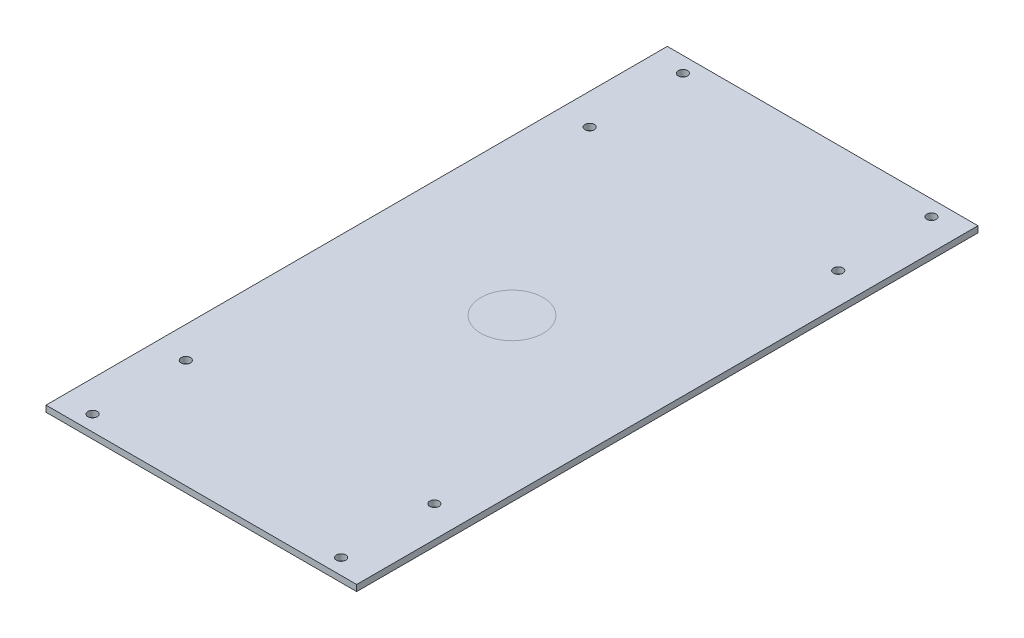
ISO-10303-21;
HEADER;
FILE_DESCRIPTION(('STEP AP214'),'2;1');
FILE_NAME('part.step','',(''),(''),'','','');
FILE_SCHEMA(('AUTOMOTIVE_DESIGN { 1 0 10303 214 1 1 1 1 }'));
ENDSEC;
DATA;
#1=APPLICATION_CONTEXT('core data for automotive mechanical design processes');
#2=APPLICATION_PROTOCOL_DEFINITION('international standard','automotive_design',2000,#1);
#3=PRODUCT_CONTEXT('',#1,'mechanical');
#4=PRODUCT('Part','Part','',(#3));
#5=PRODUCT_RELATED_PRODUCT_CATEGORY('part','',(#4));
#6=PRODUCT_DEFINITION_FORMATION('','',#4);
#7=PRODUCT_DEFINITION_CONTEXT('part definition',#1,'design');
#8=PRODUCT_DEFINITION('design','',#6,#7);
#9=PRODUCT_DEFINITION_SHAPE('','',#8);
#10=(LENGTH_UNIT() NAMED_UNIT(*) SI_UNIT(.MILLI.,.METRE.));
#11=(NAMED_UNIT(*) PLANE_ANGLE_UNIT() SI_UNIT($,.RADIAN.));
#12=(NAMED_UNIT(*) SI_UNIT($,.STERADIAN.) SOLID_ANGLE_UNIT());
#13=UNCERTAINTY_MEASURE_WITH_UNIT(LENGTH_MEASURE(1.E-05),#10,'distance_accuracy_value','');
#14=(GEOMETRIC_REPRESENTATION_CONTEXT(3) GLOBAL_UNCERTAINTY_ASSIGNED_CONTEXT((#13)) GLOBAL_UNIT_ASSIGNED_CONTEXT((#10,
#11,#12)) REPRESENTATION_CONTEXT('',''));
#15=CARTESIAN_POINT('',(0.,0.,0.));
#16=DIRECTION('',(0.,0.,1.));
#17=DIRECTION('',(1.,0.,0.));
#18=AXIS2_PLACEMENT_3D('',#15,#16,#17);
#19=CARTESIAN_POINT('',(0.,2.,0.));
#20=DIRECTION('',(0.,-1.,0.));
#21=DIRECTION('',(0.,0.,-1.));
#22=AXIS2_PLACEMENT_3D('',#19,#20,#21);
#23=PLANE('',#22);
#24=CARTESIAN_POINT('',(-40.,2.,-95.));
#25=DIRECTION('',(0.,1.,0.));
#26=DIRECTION('',(0.,0.,1.));
#27=AXIS2_PLACEMENT_3D('',#24,#25,#26);
#28=CIRCLE('',#27,1.49999999999999);
#29=CARTESIAN_POINT('',(-40.,2.,-93.5));
#30=VERTEX_POINT('',#29);
#31=EDGE_CURVE('E177',#30,#30,#28,.T.);
#32=ORIENTED_EDGE('',*,*,#31,.F.);
#33=EDGE_LOOP('',(#32));
#34=FACE_BOUND('',#33,.T.);
#35=CARTESIAN_POINT('',(40.,2.,-95.));
#36=DIRECTION('',(0.,1.,0.));
#37=DIRECTION('',(0.,0.,1.));
#38=AXIS2_PLACEMENT_3D('',#35,#36,#37);
#39=CIRCLE('',#38,1.49999999999999);
#40=CARTESIAN_POINT('',(40.,2.,-93.5));
#41=VERTEX_POINT('',#40);
#42=EDGE_CURVE('E179',#41,#41,#39,.T.);
#43=ORIENTED_EDGE('',*,*,#42,.F.);
#44=EDGE_LOOP('',(#43));
#45=FACE_BOUND('',#44,.T.);
#46=CARTESIAN_POINT('',(-40.,2.,-65.));
#47=DIRECTION('',(0.,1.,0.));
#48=DIRECTION('',(0.,0.,1.));
#49=AXIS2_PLACEMENT_3D('',#46,#47,#48);
#50=CIRCLE('',#49,1.49999999999999);
#51=CARTESIAN_POINT('',(-40.,2.,-63.5));
#52=VERTEX_POINT('',#51);
#53=EDGE_CURVE('E187',#52,#52,#50,.T.);
#54=ORIENTED_EDGE('',*,*,#53,.F.);
#55=EDGE_LOOP('',(#54));
#56=FACE_BOUND('',#55,.T.);
#57=CARTESIAN_POINT('',(40.,2.,-65.));
#58=DIRECTION('',(0.,1.,0.));
#59=DIRECTION('',(0.,0.,1.));
#60=AXIS2_PLACEMENT_3D('',#57,#58,#59);
#61=CIRCLE('',#60,1.49999999999999);
#62=CARTESIAN_POINT('',(40.,2.,-63.5));
#63=VERTEX_POINT('',#62);
#64=EDGE_CURVE('E193',#63,#63,#61,.T.);
#65=ORIENTED_EDGE('',*,*,#64,.F.);
#66=EDGE_LOOP('',(#65));
#67=FACE_BOUND('',#66,.T.);
#68=CARTESIAN_POINT('',(-40.,2.,65.));
#69=DIRECTION('',(0.,1.,0.));
#70=DIRECTION('',(0.,0.,1.));
#71=AXIS2_PLACEMENT_3D('',#68,#69,#70);
#72=CIRCLE('',#71,1.49999999999999);
#73=CARTESIAN_POINT('',(-40.,2.,66.5));
#74=VERTEX_POINT('',#73);
#75=EDGE_CURVE('E199',#74,#74,#72,.T.);
#76=ORIENTED_EDGE('',*,*,#75,.F.);
#77=EDGE_LOOP('',(#76));
#78=FACE_BOUND('',#77,.T.);
#79=CARTESIAN_POINT('',(-40.,2.,95.));
#80=DIRECTION('',(0.,1.,0.));
#81=DIRECTION('',(0.,0.,1.));
#82=AXIS2_PLACEMENT_3D('',#79,#80,#81);
#83=CIRCLE('',#82,1.49999999999999);
#84=CARTESIAN_POINT('',(-40.,2.,96.5));
#85=VERTEX_POINT('',#84);
#86=EDGE_CURVE('E205',#85,#85,#83,.T.);
#87=ORIENTED_EDGE('',*,*,#86,.F.);
#88=EDGE_LOOP('',(#87));
#89=FACE_BOUND('',#88,.T.);
#90=CARTESIAN_POINT('',(40.,2.,65.));
#91=DIRECTION('',(0.,1.,0.));
#92=DIRECTION('',(0.,0.,1.));
#93=AXIS2_PLACEMENT_3D('',#90,#91,#92);
#94=CIRCLE('',#93,1.49999999999999);
#95=CARTESIAN_POINT('',(40.,2.,66.5));
#96=VERTEX_POINT('',#95);
#97=EDGE_CURVE('E211',#96,#96,#94,.T.);
#98=ORIENTED_EDGE('',*,*,#97,.F.);
#99=EDGE_LOOP('',(#98));
#100=FACE_BOUND('',#99,.T.);
#101=CARTESIAN_POINT('',(40.,2.,95.));
#102=DIRECTION('',(0.,1.,0.));
#103=DIRECTION('',(0.,0.,1.));
#104=AXIS2_PLACEMENT_3D('',#101,#102,#103);
#105=CIRCLE('',#104,1.49999999999999);
#106=CARTESIAN_POINT('',(40.,2.,96.5));
#107=VERTEX_POINT('',#106);
#108=EDGE_CURVE('E217',#107,#107,#105,.T.);
#109=ORIENTED_EDGE('',*,*,#108,.F.);
#110=EDGE_LOOP('',(#109));
#111=FACE_BOUND('',#110,.T.);
#112=DIRECTION('',(1.,0.,0.));
#113=VECTOR('',#112,1.);
#114=CARTESIAN_POINT('',(-50.,2.,-100.));
#115=LINE('',#114,#113);
#116=CARTESIAN_POINT('',(-50.,2.,-100.));
#117=VERTEX_POINT('',#116);
#118=CARTESIAN_POINT('',(50.,2.,-100.));
#119=VERTEX_POINT('',#118);
#120=EDGE_CURVE('E102',#117,#119,#115,.T.);
#121=ORIENTED_EDGE('',*,*,#120,.F.);
#122=DIRECTION('',(0.,0.,1.));
#123=VECTOR('',#122,1.);
#124=CARTESIAN_POINT('',(-50.,2.,-100.));
#125=LINE('',#124,#123);
#126=CARTESIAN_POINT('',(-50.,2.,100.));
#127=VERTEX_POINT('',#126);
#128=EDGE_CURVE('E90',#117,#127,#125,.T.);
#129=ORIENTED_EDGE('',*,*,#128,.T.);
#130=DIRECTION('',(1.,0.,0.));
#131=VECTOR('',#130,1.);
#132=CARTESIAN_POINT('',(-50.,2.,100.));
#133=LINE('',#132,#131);
#134=CARTESIAN_POINT('',(50.,2.,100.));
#135=VERTEX_POINT('',#134);
#136=EDGE_CURVE('E85',#127,#135,#133,.T.);
#137=ORIENTED_EDGE('',*,*,#136,.T.);
#138=DIRECTION('',(0.,0.,1.));
#139=VECTOR('',#138,1.);
#140=CARTESIAN_POINT('',(50.,2.,-100.));
#141=LINE('',#140,#139);
#142=EDGE_CURVE('E89',#119,#135,#141,.T.);
#143=ORIENTED_EDGE('',*,*,#142,.F.);
#144=EDGE_LOOP('',(#121,#129,#137,#143));
#145=FACE_BOUND('',#144,.T.);
#146=CARTESIAN_POINT('',(0.,2.,0.));
#147=DIRECTION('',(0.,-1.,0.));
#148=DIRECTION('',(0.,0.,-1.));
#149=AXIS2_PLACEMENT_3D('',#146,#147,#148);
#150=CIRCLE('',#149,10.);
#151=CARTESIAN_POINT('',(0.,2.,-10.));
#152=VERTEX_POINT('',#151);
#153=EDGE_CURVE('E11',#152,#152,#150,.F.);
#154=ORIENTED_EDGE('',*,*,#153,.F.);
#155=EDGE_LOOP('',(#154));
#156=FACE_BOUND('',#155,.T.);
#157=ADVANCED_FACE('F38',(#34,#45,#56,#67,#78,#89,#100,#111,#145,#156),#23,.F.);
#158=CARTESIAN_POINT('',(-50.,2.,-100.));
#159=DIRECTION('',(0.,0.,-1.));
#160=DIRECTION('',(-1.,0.,0.));
#161=AXIS2_PLACEMENT_3D('',#158,#159,#160);
#162=PLANE('',#161);
#163=DIRECTION('',(1.,0.,0.));
#164=VECTOR('',#163,1.);
#165=CARTESIAN_POINT('',(-50.,0.,-100.));
#166=LINE('',#165,#164);
#167=CARTESIAN_POINT('',(-50.,0.,-100.));
#168=VERTEX_POINT('',#167);
#169=CARTESIAN_POINT('',(50.,0.,-100.));
#170=VERTEX_POINT('',#169);
#171=EDGE_CURVE('E108',#168,#170,#166,.T.);
#172=ORIENTED_EDGE('',*,*,#171,.F.);
#173=DIRECTION('',(0.,-1.,0.));
#174=VECTOR('',#173,1.);
#175=CARTESIAN_POINT('',(-50.,2.,-100.));
#176=LINE('',#175,#174);
#177=EDGE_CURVE('E48',#117,#168,#176,.T.);
#178=ORIENTED_EDGE('',*,*,#177,.F.);
#179=ORIENTED_EDGE('',*,*,#120,.T.);
#180=DIRECTION('',(0.,-1.,0.));
#181=VECTOR('',#180,1.);
#182=CARTESIAN_POINT('',(50.,2.,-100.));
#183=LINE('',#182,#181);
#184=EDGE_CURVE('E80',#119,#170,#183,.T.);
#185=ORIENTED_EDGE('',*,*,#184,.T.);
#186=EDGE_LOOP('',(#172,#178,#179,#185));
#187=FACE_BOUND('',#186,.T.);
#188=ADVANCED_FACE('F40',(#187),#162,.T.);
#189=CARTESIAN_POINT('',(-50.,2.,-100.));
#190=DIRECTION('',(1.,0.,0.));
#191=DIRECTION('',(0.,0.,-1.));
#192=AXIS2_PLACEMENT_3D('',#189,#190,#191);
#193=PLANE('',#192);
#194=DIRECTION('',(0.,0.,1.));
#195=VECTOR('',#194,1.);
#196=CARTESIAN_POINT('',(-50.,0.,-100.));
#197=LINE('',#196,#195);
#198=CARTESIAN_POINT('',(-50.,0.,100.));
#199=VERTEX_POINT('',#198);
#200=EDGE_CURVE('E72',#168,#199,#197,.T.);
#201=ORIENTED_EDGE('',*,*,#200,.T.);
#202=DIRECTION('',(0.,-1.,0.));
#203=VECTOR('',#202,1.);
#204=CARTESIAN_POINT('',(-50.,2.,100.));
#205=LINE('',#204,#203);
#206=EDGE_CURVE('E99',#127,#199,#205,.T.);
#207=ORIENTED_EDGE('',*,*,#206,.F.);
#208=ORIENTED_EDGE('',*,*,#128,.F.);
#209=ORIENTED_EDGE('',*,*,#177,.T.);
#210=EDGE_LOOP('',(#201,#207,#208,#209));
#211=FACE_BOUND('',#210,.T.);
#212=ADVANCED_FACE('F141',(#211),#193,.F.);
#213=CARTESIAN_POINT('',(-50.,2.,100.));
#214=DIRECTION('',(0.,0.,-1.));
#215=DIRECTION('',(-1.,0.,0.));
#216=AXIS2_PLACEMENT_3D('',#213,#214,#215);
#217=PLANE('',#216);
#218=DIRECTION('',(1.,0.,0.));
#219=VECTOR('',#218,1.);
#220=CARTESIAN_POINT('',(-50.,0.,100.));
#221=LINE('',#220,#219);
#222=CARTESIAN_POINT('',(50.,0.,100.));
#223=VERTEX_POINT('',#222);
#224=EDGE_CURVE('E97',#199,#223,#221,.T.);
#225=ORIENTED_EDGE('',*,*,#224,.T.);
#226=DIRECTION('',(0.,-1.,0.));
#227=VECTOR('',#226,1.);
#228=CARTESIAN_POINT('',(50.,2.,100.));
#229=LINE('',#228,#227);
#230=EDGE_CURVE('E94',#135,#223,#229,.T.);
#231=ORIENTED_EDGE('',*,*,#230,.F.);
#232=ORIENTED_EDGE('',*,*,#136,.F.);
#233=ORIENTED_EDGE('',*,*,#206,.T.);
#234=EDGE_LOOP('',(#225,#231,#232,#233));
#235=FACE_BOUND('',#234,.T.);
#236=ADVANCED_FACE('F95',(#235),#217,.F.);
#237=CARTESIAN_POINT('',(50.,2.,-100.));
#238=DIRECTION('',(1.,0.,0.));
#239=DIRECTION('',(0.,0.,-1.));
#240=AXIS2_PLACEMENT_3D('',#237,#238,#239);
#241=PLANE('',#240);
#242=DIRECTION('',(0.,0.,1.));
#243=VECTOR('',#242,1.);
#244=CARTESIAN_POINT('',(50.,0.,-100.));
#245=LINE('',#244,#243);
#246=EDGE_CURVE('E111',#170,#223,#245,.T.);
#247=ORIENTED_EDGE('',*,*,#246,.F.);
#248=ORIENTED_EDGE('',*,*,#184,.F.);
#249=ORIENTED_EDGE('',*,*,#142,.T.);
#250=ORIENTED_EDGE('',*,*,#230,.T.);
#251=EDGE_LOOP('',(#247,#248,#249,#250));
#252=FACE_BOUND('',#251,.T.);
#253=ADVANCED_FACE('F101',(#252),#241,.T.);
#254=ORIENTED_EDGE('',*,*,#153,.T.);
#255=EDGE_LOOP('',(#254));
#256=FACE_BOUND('',#255,.T.);
#257=ADVANCED_FACE('F121',(#256),#23,.F.);
#258=CARTESIAN_POINT('',(0.,0.,0.));
#259=DIRECTION('',(0.,-1.,0.));
#260=DIRECTION('',(0.,0.,-1.));
#261=AXIS2_PLACEMENT_3D('',#258,#259,#260);
#262=PLANE('',#261);
#263=CARTESIAN_POINT('',(-40.,0.,-95.));
#264=DIRECTION('',(0.,1.,0.));
#265=DIRECTION('',(0.,0.,1.));
#266=AXIS2_PLACEMENT_3D('',#263,#264,#265);
#267=CIRCLE('',#266,1.5);
#268=CARTESIAN_POINT('',(-40.,0.,-93.5));
#269=VERTEX_POINT('',#268);
#270=EDGE_CURVE('E175',#269,#269,#267,.T.);
#271=ORIENTED_EDGE('',*,*,#270,.T.);
#272=EDGE_LOOP('',(#271));
#273=FACE_BOUND('',#272,.T.);
#274=CARTESIAN_POINT('',(40.,0.,-95.));
#275=DIRECTION('',(0.,1.,0.));
#276=DIRECTION('',(0.,0.,1.));
#277=AXIS2_PLACEMENT_3D('',#274,#275,#276);
#278=CIRCLE('',#277,1.5);
#279=CARTESIAN_POINT('',(40.,0.,-93.5));
#280=VERTEX_POINT('',#279);
#281=EDGE_CURVE('E184',#280,#280,#278,.T.);
#282=ORIENTED_EDGE('',*,*,#281,.T.);
#283=EDGE_LOOP('',(#282));
#284=FACE_BOUND('',#283,.T.);
#285=CARTESIAN_POINT('',(-40.,0.,-65.));
#286=DIRECTION('',(0.,1.,0.));
#287=DIRECTION('',(0.,0.,1.));
#288=AXIS2_PLACEMENT_3D('',#285,#286,#287);
#289=CIRCLE('',#288,1.5);
#290=CARTESIAN_POINT('',(-40.,0.,-63.5));
#291=VERTEX_POINT('',#290);
#292=EDGE_CURVE('E190',#291,#291,#289,.T.);
#293=ORIENTED_EDGE('',*,*,#292,.T.);
#294=EDGE_LOOP('',(#293));
#295=FACE_BOUND('',#294,.T.);
#296=CARTESIAN_POINT('',(40.,0.,-65.));
#297=DIRECTION('',(0.,1.,0.));
#298=DIRECTION('',(0.,0.,1.));
#299=AXIS2_PLACEMENT_3D('',#296,#297,#298);
#300=CIRCLE('',#299,1.5);
#301=CARTESIAN_POINT('',(40.,0.,-63.5));
#302=VERTEX_POINT('',#301);
#303=EDGE_CURVE('E196',#302,#302,#300,.T.);
#304=ORIENTED_EDGE('',*,*,#303,.T.);
#305=EDGE_LOOP('',(#304));
#306=FACE_BOUND('',#305,.T.);
#307=CARTESIAN_POINT('',(-40.,0.,65.));
#308=DIRECTION('',(0.,1.,0.));
#309=DIRECTION('',(0.,0.,1.));
#310=AXIS2_PLACEMENT_3D('',#307,#308,#309);
#311=CIRCLE('',#310,1.5);
#312=CARTESIAN_POINT('',(-40.,0.,66.5));
#313=VERTEX_POINT('',#312);
#314=EDGE_CURVE('E202',#313,#313,#311,.T.);
#315=ORIENTED_EDGE('',*,*,#314,.T.);
#316=EDGE_LOOP('',(#315));
#317=FACE_BOUND('',#316,.T.);
#318=CARTESIAN_POINT('',(-40.,0.,95.));
#319=DIRECTION('',(0.,1.,0.));
#320=DIRECTION('',(0.,0.,1.));
#321=AXIS2_PLACEMENT_3D('',#318,#319,#320);
#322=CIRCLE('',#321,1.5);
#323=CARTESIAN_POINT('',(-40.,0.,96.5));
#324=VERTEX_POINT('',#323);
#325=EDGE_CURVE('E208',#324,#324,#322,.T.);
#326=ORIENTED_EDGE('',*,*,#325,.T.);
#327=EDGE_LOOP('',(#326));
#328=FACE_BOUND('',#327,.T.);
#329=CARTESIAN_POINT('',(40.,0.,65.));
#330=DIRECTION('',(0.,1.,0.));
#331=DIRECTION('',(0.,0.,1.));
#332=AXIS2_PLACEMENT_3D('',#329,#330,#331);
#333=CIRCLE('',#332,1.5);
#334=CARTESIAN_POINT('',(40.,0.,66.5));
#335=VERTEX_POINT('',#334);
#336=EDGE_CURVE('E214',#335,#335,#333,.T.);
#337=ORIENTED_EDGE('',*,*,#336,.T.);
#338=EDGE_LOOP('',(#337));
#339=FACE_BOUND('',#338,.T.);
#340=CARTESIAN_POINT('',(40.,0.,95.));
#341=DIRECTION('',(0.,1.,0.));
#342=DIRECTION('',(0.,0.,1.));
#343=AXIS2_PLACEMENT_3D('',#340,#341,#342);
#344=CIRCLE('',#343,1.5);
#345=CARTESIAN_POINT('',(40.,0.,96.5));
#346=VERTEX_POINT('',#345);
#347=EDGE_CURVE('E112',#346,#346,#344,.T.);
#348=ORIENTED_EDGE('',*,*,#347,.T.);
#349=EDGE_LOOP('',(#348));
#350=FACE_BOUND('',#349,.T.);
#351=ORIENTED_EDGE('',*,*,#171,.T.);
#352=ORIENTED_EDGE('',*,*,#246,.T.);
#353=ORIENTED_EDGE('',*,*,#224,.F.);
#354=ORIENTED_EDGE('',*,*,#200,.F.);
#355=EDGE_LOOP('',(#351,#352,#353,#354));
#356=FACE_BOUND('',#355,.T.);
#357=ADVANCED_FACE('F118',(#273,#284,#295,#306,#317,#328,#339,#350,#356),#262,.T.);
#358=CARTESIAN_POINT('',(40.,2.,95.));
#359=DIRECTION('',(0.,1.,0.));
#360=DIRECTION('',(0.,0.,1.));
#361=AXIS2_PLACEMENT_3D('',#358,#359,#360);
#362=CYLINDRICAL_SURFACE('',#361,1.49999999999999);
#363=ORIENTED_EDGE('',*,*,#347,.F.);
#364=EDGE_LOOP('',(#363));
#365=FACE_BOUND('',#364,.T.);
#366=ORIENTED_EDGE('',*,*,#108,.T.);
#367=EDGE_LOOP('',(#366));
#368=FACE_BOUND('',#367,.T.);
#369=ADVANCED_FACE('F120',(#365,#368),#362,.F.);
#370=CARTESIAN_POINT('',(40.,2.,65.));
#371=DIRECTION('',(0.,1.,0.));
#372=DIRECTION('',(0.,0.,1.));
#373=AXIS2_PLACEMENT_3D('',#370,#371,#372);
#374=CYLINDRICAL_SURFACE('',#373,1.49999999999999);
#375=ORIENTED_EDGE('',*,*,#336,.F.);
#376=EDGE_LOOP('',(#375));
#377=FACE_BOUND('',#376,.T.);
#378=ORIENTED_EDGE('',*,*,#97,.T.);
#379=EDGE_LOOP('',(#378));
#380=FACE_BOUND('',#379,.T.);
#381=ADVANCED_FACE('F128',(#377,#380),#374,.F.);
#382=CARTESIAN_POINT('',(-40.,2.,95.));
#383=DIRECTION('',(0.,1.,0.));
#384=DIRECTION('',(0.,0.,1.));
#385=AXIS2_PLACEMENT_3D('',#382,#383,#384);
#386=CYLINDRICAL_SURFACE('',#385,1.49999999999999);
#387=ORIENTED_EDGE('',*,*,#325,.F.);
#388=EDGE_LOOP('',(#387));
#389=FACE_BOUND('',#388,.T.);
#390=ORIENTED_EDGE('',*,*,#86,.T.);
#391=EDGE_LOOP('',(#390));
#392=FACE_BOUND('',#391,.T.);
#393=ADVANCED_FACE('F147',(#389,#392),#386,.F.);
#394=CARTESIAN_POINT('',(-40.,2.,65.));
#395=DIRECTION('',(0.,1.,0.));
#396=DIRECTION('',(0.,0.,1.));
#397=AXIS2_PLACEMENT_3D('',#394,#395,#396);
#398=CYLINDRICAL_SURFACE('',#397,1.49999999999999);
#399=ORIENTED_EDGE('',*,*,#314,.F.);
#400=EDGE_LOOP('',(#399));
#401=FACE_BOUND('',#400,.T.);
#402=ORIENTED_EDGE('',*,*,#75,.T.);
#403=EDGE_LOOP('',(#402));
#404=FACE_BOUND('',#403,.T.);
#405=ADVANCED_FACE('F151',(#401,#404),#398,.F.);
#406=CARTESIAN_POINT('',(40.,2.,-65.));
#407=DIRECTION('',(0.,1.,0.));
#408=DIRECTION('',(0.,0.,1.));
#409=AXIS2_PLACEMENT_3D('',#406,#407,#408);
#410=CYLINDRICAL_SURFACE('',#409,1.49999999999999);
#411=ORIENTED_EDGE('',*,*,#303,.F.);
#412=EDGE_LOOP('',(#411));
#413=FACE_BOUND('',#412,.T.);
#414=ORIENTED_EDGE('',*,*,#64,.T.);
#415=EDGE_LOOP('',(#414));
#416=FACE_BOUND('',#415,.T.);
#417=ADVANCED_FACE('F155',(#413,#416),#410,.F.);
#418=CARTESIAN_POINT('',(-40.,2.,-65.));
#419=DIRECTION('',(0.,1.,0.));
#420=DIRECTION('',(0.,0.,1.));
#421=AXIS2_PLACEMENT_3D('',#418,#419,#420);
#422=CYLINDRICAL_SURFACE('',#421,1.49999999999999);
#423=ORIENTED_EDGE('',*,*,#292,.F.);
#424=EDGE_LOOP('',(#423));
#425=FACE_BOUND('',#424,.T.);
#426=ORIENTED_EDGE('',*,*,#53,.T.);
#427=EDGE_LOOP('',(#426));
#428=FACE_BOUND('',#427,.T.);
#429=ADVANCED_FACE('F159',(#425,#428),#422,.F.);
#430=CARTESIAN_POINT('',(40.,2.,-95.));
#431=DIRECTION('',(0.,1.,0.));
#432=DIRECTION('',(0.,0.,1.));
#433=AXIS2_PLACEMENT_3D('',#430,#431,#432);
#434=CYLINDRICAL_SURFACE('',#433,1.49999999999999);
#435=ORIENTED_EDGE('',*,*,#281,.F.);
#436=EDGE_LOOP('',(#435));
#437=FACE_BOUND('',#436,.T.);
#438=ORIENTED_EDGE('',*,*,#42,.T.);
#439=EDGE_LOOP('',(#438));
#440=FACE_BOUND('',#439,.T.);
#441=ADVANCED_FACE('F163',(#437,#440),#434,.F.);
#442=CARTESIAN_POINT('',(-40.,2.,-95.));
#443=DIRECTION('',(0.,1.,0.));
#444=DIRECTION('',(0.,0.,1.));
#445=AXIS2_PLACEMENT_3D('',#442,#443,#444);
#446=CYLINDRICAL_SURFACE('',#445,1.49999999999999);
#447=ORIENTED_EDGE('',*,*,#270,.F.);
#448=EDGE_LOOP('',(#447));
#449=FACE_BOUND('',#448,.T.);
#450=ORIENTED_EDGE('',*,*,#31,.T.);
#451=EDGE_LOOP('',(#450));
#452=FACE_BOUND('',#451,.T.);
#453=ADVANCED_FACE('F167',(#449,#452),#446,.F.);
#454=CLOSED_SHELL('',(#157,#188,#212,#236,#253,#257,#357,#369,#381,#393,#405,#417,#429,#441,#453));
#455=MANIFOLD_SOLID_BREP('B2',#454);
#456=ADVANCED_BREP_SHAPE_REPRESENTATION('',(#18,#455),#14);
#457=SHAPE_DEFINITION_REPRESENTATION(#9,#456);
ENDSEC;
END-ISO-10303-21;
